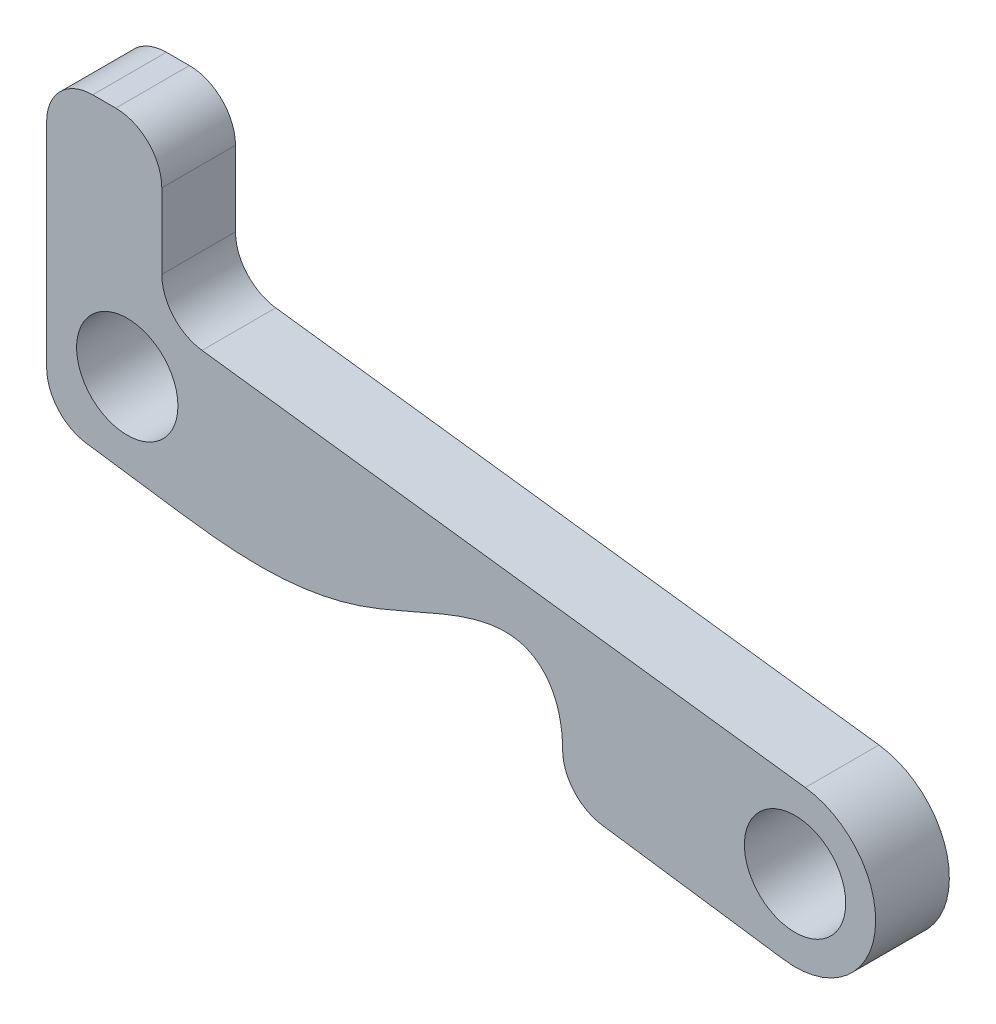
ISO-10303-21;
HEADER;
FILE_DESCRIPTION(('STEP AP214'),'2;1');
FILE_NAME('part.step','',(''),(''),'','','');
FILE_SCHEMA(('AUTOMOTIVE_DESIGN { 1 0 10303 214 1 1 1 1 }'));
ENDSEC;
DATA;
#1=APPLICATION_CONTEXT('core data for automotive mechanical design processes');
#2=APPLICATION_PROTOCOL_DEFINITION('international standard','automotive_design',2000,#1);
#3=PRODUCT_CONTEXT('',#1,'mechanical');
#4=PRODUCT('Part','Part','',(#3));
#5=PRODUCT_RELATED_PRODUCT_CATEGORY('part','',(#4));
#6=PRODUCT_DEFINITION_FORMATION('','',#4);
#7=PRODUCT_DEFINITION_CONTEXT('part definition',#1,'design');
#8=PRODUCT_DEFINITION('design','',#6,#7);
#9=PRODUCT_DEFINITION_SHAPE('','',#8);
#10=(LENGTH_UNIT() NAMED_UNIT(*) SI_UNIT(.MILLI.,.METRE.));
#11=(NAMED_UNIT(*) PLANE_ANGLE_UNIT() SI_UNIT($,.RADIAN.));
#12=(NAMED_UNIT(*) SI_UNIT($,.STERADIAN.) SOLID_ANGLE_UNIT());
#13=UNCERTAINTY_MEASURE_WITH_UNIT(LENGTH_MEASURE(1.E-05),#10,'distance_accuracy_value','');
#14=(GEOMETRIC_REPRESENTATION_CONTEXT(3) GLOBAL_UNCERTAINTY_ASSIGNED_CONTEXT((#13)) GLOBAL_UNIT_ASSIGNED_CONTEXT((#10,
#11,#12)) REPRESENTATION_CONTEXT('',''));
#15=CARTESIAN_POINT('',(0.,0.,0.));
#16=DIRECTION('',(0.,0.,1.));
#17=DIRECTION('',(1.,0.,0.));
#18=AXIS2_PLACEMENT_3D('',#15,#16,#17);
#19=CARTESIAN_POINT('',(5.85628286748262,-1.4674836129395,0.8));
#20=DIRECTION('',(0.,0.,-1.));
#21=DIRECTION('',(-1.,0.,0.));
#22=AXIS2_PLACEMENT_3D('',#19,#20,#21);
#23=PLANE('',#22);
#24=DIRECTION('',(0.,-1.,0.));
#25=VECTOR('',#24,1.);
#26=CARTESIAN_POINT('',(-1.75,4.92594525489793,0.8));
#27=LINE('',#26,#25);
#28=CARTESIAN_POINT('',(-1.75,3.92594525489793,0.8));
#29=VERTEX_POINT('',#28);
#30=CARTESIAN_POINT('',(-1.75,-0.705270965977039,0.8));
#31=VERTEX_POINT('',#30);
#32=EDGE_CURVE('E152',#29,#31,#27,.T.);
#33=ORIENTED_EDGE('',*,*,#32,.T.);
#34=CARTESIAN_POINT('',(-0.75,-0.705270965977041,0.8));
#35=DIRECTION('',(0.,0.,-1.));
#36=DIRECTION('',(-1.,0.,0.));
#37=AXIS2_PLACEMENT_3D('',#34,#35,#36);
#38=CIRCLE('',#37,1.);
#39=CARTESIAN_POINT('',(-0.889740600423094,-1.69545911203485,0.8));
#40=VERTEX_POINT('',#39);
#41=EDGE_CURVE('E147',#31,#40,#38,.F.);
#42=ORIENTED_EDGE('',*,*,#41,.T.);
#43=DIRECTION('',(0.990188146057805,-0.139740600423094,0.));
#44=VECTOR('',#43,1.);
#45=CARTESIAN_POINT('',(-1.75,-1.57405474510207,0.8));
#46=LINE('',#45,#44);
#47=CARTESIAN_POINT('',(1.13862290650122,-1.98171252302786,0.8));
#48=VERTEX_POINT('',#47);
#49=EDGE_CURVE('E139',#40,#48,#46,.T.);
#50=ORIENTED_EDGE('',*,*,#49,.T.);
#51=CARTESIAN_POINT('',(1.13862290650122,-1.98171252302786,0.8));
#52=CARTESIAN_POINT('',(2.48765410382144,-2.17209495716781,0.8));
#53=CARTESIAN_POINT('',(4.93090822651227,-2.30081907392415,0.8));
#54=CARTESIAN_POINT('',(8.48904271772371,0.0589233454925276,0.8));
#55=CARTESIAN_POINT('',(9.45087001881699,-1.49490037842196,0.8));
#56=CARTESIAN_POINT('',(9.4525852891331,-2.28840050606604,0.8));
#57=B_SPLINE_CURVE_WITH_KNOTS('',3,(#51,#52,#53,#54,#55,#56),.UNSPECIFIED.,.F.,.F.,(4,1,1,4),
(0.0513534356355238,0.45935835109183,0.836024653398881,1.),.UNSPECIFIED.);
#58=CARTESIAN_POINT('',(9.4525852891331,-2.28840050606604,0.8));
#59=VERTEX_POINT('',#58);
#60=EDGE_CURVE('E144',#48,#59,#57,.T.);
#61=ORIENTED_EDGE('',*,*,#60,.T.);
#62=CARTESIAN_POINT('',(10.4525829527738,-2.28623886015212,0.8));
#63=DIRECTION('',(0.,0.,1.));
#64=DIRECTION('',(-1.,0.,0.));
#65=AXIS2_PLACEMENT_3D('',#62,#63,#64);
#66=CIRCLE('',#65,1.);
#67=CARTESIAN_POINT('',(10.3128423523507,-3.27642700620993,0.8));
#68=VERTEX_POINT('',#67);
#69=EDGE_CURVE('E169',#59,#68,#66,.T.);
#70=ORIENTED_EDGE('',*,*,#69,.T.);
#71=DIRECTION('',(0.990188146057805,-0.139740600423094,0.));
#72=VECTOR('',#71,1.);
#73=CARTESIAN_POINT('',(12.7129072328709,-3.61513688553289,0.8));
#74=LINE('',#73,#72);
#75=CARTESIAN_POINT('',(14.2554539492596,-3.83282925560116,0.8));
#76=VERTEX_POINT('',#75);
#77=EDGE_CURVE('E172',#68,#76,#74,.T.);
#78=ORIENTED_EDGE('',*,*,#77,.T.);
#79=CARTESIAN_POINT('',(14.5,-2.1,0.8));
#80=DIRECTION('',(0.,0.,1.));
#81=DIRECTION('',(1.,0.,0.));
#82=AXIS2_PLACEMENT_3D('',#79,#80,#81);
#83=CIRCLE('',#82,1.75);
#84=CARTESIAN_POINT('',(14.7215004753904,-0.364074443012661,0.8));
#85=VERTEX_POINT('',#84);
#86=EDGE_CURVE('E262',#76,#85,#83,.T.);
#87=ORIENTED_EDGE('',*,*,#86,.T.);
#88=DIRECTION('',(-0.991957461135623,0.126571700223113,0.));
#89=VECTOR('',#88,1.);
#90=CARTESIAN_POINT('',(0.749999999999999,1.41865983655381,0.8));
#91=LINE('',#90,#89);
#92=CARTESIAN_POINT('',(1.62342829977689,1.30721220975822,0.8));
#93=VERTEX_POINT('',#92);
#94=EDGE_CURVE('E277',#85,#93,#91,.T.);
#95=ORIENTED_EDGE('',*,*,#94,.T.);
#96=CARTESIAN_POINT('',(1.75,2.29916967089385,0.8));
#97=DIRECTION('',(0.,0.,-1.));
#98=DIRECTION('',(-1.,0.,0.));
#99=AXIS2_PLACEMENT_3D('',#96,#97,#98);
#100=CIRCLE('',#99,1.);
#101=CARTESIAN_POINT('',(0.749999999999999,2.29916967089384,0.8));
#102=VERTEX_POINT('',#101);
#103=EDGE_CURVE('E11',#93,#102,#100,.T.);
#104=ORIENTED_EDGE('',*,*,#103,.T.);
#105=DIRECTION('',(0.,1.,0.));
#106=VECTOR('',#105,1.);
#107=CARTESIAN_POINT('',(0.749999999999999,1.41865983655381,0.8));
#108=LINE('',#107,#106);
#109=CARTESIAN_POINT('',(0.749999999999999,3.92594525489793,0.8));
#110=VERTEX_POINT('',#109);
#111=EDGE_CURVE('E272',#102,#110,#108,.T.);
#112=ORIENTED_EDGE('',*,*,#111,.T.);
#113=CARTESIAN_POINT('',(-0.25,3.92594525489793,0.8));
#114=DIRECTION('',(0.,0.,-1.));
#115=DIRECTION('',(-1.,0.,0.));
#116=AXIS2_PLACEMENT_3D('',#113,#114,#115);
#117=CIRCLE('',#116,1.);
#118=CARTESIAN_POINT('',(-0.25,4.92594525489793,0.8));
#119=VERTEX_POINT('',#118);
#120=EDGE_CURVE('E301',#110,#119,#117,.F.);
#121=ORIENTED_EDGE('',*,*,#120,.T.);
#122=DIRECTION('',(-1.,0.,0.));
#123=VECTOR('',#122,1.);
#124=CARTESIAN_POINT('',(0.749999999999999,4.92594525489793,0.8));
#125=LINE('',#124,#123);
#126=CARTESIAN_POINT('',(-0.750000000000001,4.92594525489793,0.8));
#127=VERTEX_POINT('',#126);
#128=EDGE_CURVE('E333',#119,#127,#125,.T.);
#129=ORIENTED_EDGE('',*,*,#128,.T.);
#130=CARTESIAN_POINT('',(-0.750000000000001,3.92594525489793,0.8));
#131=DIRECTION('',(0.,0.,-1.));
#132=DIRECTION('',(-1.,0.,0.));
#133=AXIS2_PLACEMENT_3D('',#130,#131,#132);
#134=CIRCLE('',#133,1.);
#135=EDGE_CURVE('E304',#127,#29,#134,.F.);
#136=ORIENTED_EDGE('',*,*,#135,.T.);
#137=EDGE_LOOP('',(#33,#42,#50,#61,#70,#78,#87,#95,#104,#112,#121,#129,#136));
#138=FACE_BOUND('',#137,.T.);
#139=CARTESIAN_POINT('',(0.,0.,0.8));
#140=DIRECTION('',(0.,0.,1.));
#141=DIRECTION('',(1.,0.,0.));
#142=AXIS2_PLACEMENT_3D('',#139,#140,#141);
#143=CIRCLE('',#142,1.1);
#144=CARTESIAN_POINT('',(1.1,0.,0.8));
#145=VERTEX_POINT('',#144);
#146=EDGE_CURVE('E370',#145,#145,#143,.T.);
#147=ORIENTED_EDGE('',*,*,#146,.F.);
#148=EDGE_LOOP('',(#147));
#149=FACE_BOUND('',#148,.T.);
#150=CARTESIAN_POINT('',(14.5,-2.1,0.8));
#151=DIRECTION('',(0.,0.,1.));
#152=DIRECTION('',(1.,0.,0.));
#153=AXIS2_PLACEMENT_3D('',#150,#151,#152);
#154=CIRCLE('',#153,1.1);
#155=CARTESIAN_POINT('',(15.6,-2.1,0.8));
#156=VERTEX_POINT('',#155);
#157=EDGE_CURVE('E379',#156,#156,#154,.T.);
#158=ORIENTED_EDGE('',*,*,#157,.F.);
#159=EDGE_LOOP('',(#158));
#160=FACE_BOUND('',#159,.T.);
#161=ADVANCED_FACE('F41',(#138,#149,#160),#23,.F.);
#162=CARTESIAN_POINT('',(5.85628286748262,-1.4674836129395,-0.8));
#163=DIRECTION('',(0.,0.,-1.));
#164=DIRECTION('',(-1.,0.,0.));
#165=AXIS2_PLACEMENT_3D('',#162,#163,#164);
#166=PLANE('',#165);
#167=CARTESIAN_POINT('',(0.,0.,-0.8));
#168=DIRECTION('',(0.,0.,1.));
#169=DIRECTION('',(1.,0.,0.));
#170=AXIS2_PLACEMENT_3D('',#167,#168,#169);
#171=CIRCLE('',#170,1.1);
#172=CARTESIAN_POINT('',(1.1,0.,-0.8));
#173=VERTEX_POINT('',#172);
#174=EDGE_CURVE('E338',#173,#173,#171,.T.);
#175=ORIENTED_EDGE('',*,*,#174,.T.);
#176=EDGE_LOOP('',(#175));
#177=FACE_BOUND('',#176,.T.);
#178=DIRECTION('',(0.990188146057805,-0.139740600423094,0.));
#179=VECTOR('',#178,1.);
#180=CARTESIAN_POINT('',(-1.75,-1.57405474510207,-0.8));
#181=LINE('',#180,#179);
#182=CARTESIAN_POINT('',(-0.889740600423094,-1.69545911203485,-0.8));
#183=VERTEX_POINT('',#182);
#184=CARTESIAN_POINT('',(1.13862290650122,-1.98171252302786,-0.8));
#185=VERTEX_POINT('',#184);
#186=EDGE_CURVE('E158',#183,#185,#181,.T.);
#187=ORIENTED_EDGE('',*,*,#186,.F.);
#188=CARTESIAN_POINT('',(-0.75,-0.705270965977041,-0.8));
#189=DIRECTION('',(0.,0.,-1.));
#190=DIRECTION('',(-1.,0.,0.));
#191=AXIS2_PLACEMENT_3D('',#188,#189,#190);
#192=CIRCLE('',#191,1.);
#193=CARTESIAN_POINT('',(-1.75,-0.705270965977039,-0.8));
#194=VERTEX_POINT('',#193);
#195=EDGE_CURVE('E291',#183,#194,#192,.T.);
#196=ORIENTED_EDGE('',*,*,#195,.T.);
#197=DIRECTION('',(0.,-1.,0.));
#198=VECTOR('',#197,1.);
#199=CARTESIAN_POINT('',(-1.75,4.92594525489793,-0.8));
#200=LINE('',#199,#198);
#201=CARTESIAN_POINT('',(-1.75,3.92594525489793,-0.8));
#202=VERTEX_POINT('',#201);
#203=EDGE_CURVE('E349',#202,#194,#200,.T.);
#204=ORIENTED_EDGE('',*,*,#203,.F.);
#205=CARTESIAN_POINT('',(-0.750000000000001,3.92594525489793,-0.8));
#206=DIRECTION('',(0.,0.,-1.));
#207=DIRECTION('',(-1.,0.,0.));
#208=AXIS2_PLACEMENT_3D('',#205,#206,#207);
#209=CIRCLE('',#208,1.);
#210=CARTESIAN_POINT('',(-0.750000000000001,4.92594525489793,-0.8));
#211=VERTEX_POINT('',#210);
#212=EDGE_CURVE('E288',#202,#211,#209,.T.);
#213=ORIENTED_EDGE('',*,*,#212,.T.);
#214=DIRECTION('',(-1.,0.,0.));
#215=VECTOR('',#214,1.);
#216=CARTESIAN_POINT('',(0.749999999999999,4.92594525489793,-0.8));
#217=LINE('',#216,#215);
#218=CARTESIAN_POINT('',(-0.25,4.92594525489793,-0.8));
#219=VERTEX_POINT('',#218);
#220=EDGE_CURVE('E354',#219,#211,#217,.T.);
#221=ORIENTED_EDGE('',*,*,#220,.F.);
#222=CARTESIAN_POINT('',(-0.25,3.92594525489793,-0.8));
#223=DIRECTION('',(0.,0.,-1.));
#224=DIRECTION('',(-1.,0.,0.));
#225=AXIS2_PLACEMENT_3D('',#222,#223,#224);
#226=CIRCLE('',#225,1.);
#227=CARTESIAN_POINT('',(0.749999999999999,3.92594525489793,-0.8));
#228=VERTEX_POINT('',#227);
#229=EDGE_CURVE('E285',#219,#228,#226,.T.);
#230=ORIENTED_EDGE('',*,*,#229,.T.);
#231=DIRECTION('',(0.,1.,0.));
#232=VECTOR('',#231,1.);
#233=CARTESIAN_POINT('',(0.749999999999999,1.41865983655381,-0.8));
#234=LINE('',#233,#232);
#235=CARTESIAN_POINT('',(0.749999999999999,2.29916967089384,-0.8));
#236=VERTEX_POINT('',#235);
#237=EDGE_CURVE('E326',#236,#228,#234,.T.);
#238=ORIENTED_EDGE('',*,*,#237,.F.);
#239=CARTESIAN_POINT('',(1.75,2.29916967089385,-0.8));
#240=DIRECTION('',(0.,0.,-1.));
#241=DIRECTION('',(-1.,0.,0.));
#242=AXIS2_PLACEMENT_3D('',#239,#240,#241);
#243=CIRCLE('',#242,1.);
#244=CARTESIAN_POINT('',(1.62342829977689,1.30721220975822,-0.8));
#245=VERTEX_POINT('',#244);
#246=EDGE_CURVE('E50',#236,#245,#243,.F.);
#247=ORIENTED_EDGE('',*,*,#246,.T.);
#248=DIRECTION('',(-0.991957461135623,0.126571700223113,0.));
#249=VECTOR('',#248,1.);
#250=CARTESIAN_POINT('',(0.749999999999999,1.41865983655381,-0.8));
#251=LINE('',#250,#249);
#252=CARTESIAN_POINT('',(14.7215004753904,-0.364074443012661,-0.8));
#253=VERTEX_POINT('',#252);
#254=EDGE_CURVE('E268',#253,#245,#251,.T.);
#255=ORIENTED_EDGE('',*,*,#254,.F.);
#256=CARTESIAN_POINT('',(14.5,-2.1,-0.8));
#257=DIRECTION('',(0.,0.,1.));
#258=DIRECTION('',(1.,0.,0.));
#259=AXIS2_PLACEMENT_3D('',#256,#257,#258);
#260=CIRCLE('',#259,1.75);
#261=CARTESIAN_POINT('',(14.2554539492596,-3.83282925560116,-0.8));
#262=VERTEX_POINT('',#261);
#263=EDGE_CURVE('E257',#262,#253,#260,.T.);
#264=ORIENTED_EDGE('',*,*,#263,.F.);
#265=DIRECTION('',(0.990188146057805,-0.139740600423094,0.));
#266=VECTOR('',#265,1.);
#267=CARTESIAN_POINT('',(12.7129072328709,-3.61513688553289,-0.8));
#268=LINE('',#267,#266);
#269=CARTESIAN_POINT('',(10.3128423523507,-3.27642700620993,-0.8));
#270=VERTEX_POINT('',#269);
#271=EDGE_CURVE('E245',#270,#262,#268,.T.);
#272=ORIENTED_EDGE('',*,*,#271,.F.);
#273=CARTESIAN_POINT('',(10.4525829527738,-2.28623886015212,-0.8));
#274=DIRECTION('',(0.,0.,1.));
#275=DIRECTION('',(-1.,0.,0.));
#276=AXIS2_PLACEMENT_3D('',#273,#274,#275);
#277=CIRCLE('',#276,1.);
#278=CARTESIAN_POINT('',(9.4525852891331,-2.28840050606604,-0.8));
#279=VERTEX_POINT('',#278);
#280=EDGE_CURVE('E258',#279,#270,#277,.T.);
#281=ORIENTED_EDGE('',*,*,#280,.F.);
#282=CARTESIAN_POINT('',(1.13862290650122,-1.98171252302786,-0.8));
#283=CARTESIAN_POINT('',(2.48765410382144,-2.17209495716781,-0.8));
#284=CARTESIAN_POINT('',(4.93090822651227,-2.30081907392415,-0.8));
#285=CARTESIAN_POINT('',(8.48904271772371,0.0589233454925276,-0.8));
#286=CARTESIAN_POINT('',(9.45087001881699,-1.49490037842196,-0.8));
#287=CARTESIAN_POINT('',(9.4525852891331,-2.28840050606604,-0.8));
#288=B_SPLINE_CURVE_WITH_KNOTS('',3,(#282,#283,#284,#285,#286,#287),.UNSPECIFIED.,.F.,.F.,(4,1,
1,4),(0.0513534356355238,0.45935835109183,0.836024653398881,1.),.UNSPECIFIED.);
#289=EDGE_CURVE('E347',#185,#279,#288,.T.);
#290=ORIENTED_EDGE('',*,*,#289,.F.);
#291=EDGE_LOOP('',(#187,#196,#204,#213,#221,#230,#238,#247,#255,#264,#272,#281,#290));
#292=FACE_BOUND('',#291,.T.);
#293=CARTESIAN_POINT('',(14.5,-2.1,-0.8));
#294=DIRECTION('',(0.,0.,1.));
#295=DIRECTION('',(1.,0.,0.));
#296=AXIS2_PLACEMENT_3D('',#293,#294,#295);
#297=CIRCLE('',#296,1.1);
#298=CARTESIAN_POINT('',(15.6,-2.1,-0.8));
#299=VERTEX_POINT('',#298);
#300=EDGE_CURVE('E382',#299,#299,#297,.T.);
#301=ORIENTED_EDGE('',*,*,#300,.T.);
#302=EDGE_LOOP('',(#301));
#303=FACE_BOUND('',#302,.T.);
#304=ADVANCED_FACE('F200',(#177,#292,#303),#166,.T.);
#305=CARTESIAN_POINT('',(0.749999999999999,1.41865983655381,0.8));
#306=DIRECTION('',(-1.,0.,0.));
#307=DIRECTION('',(0.,0.,1.));
#308=AXIS2_PLACEMENT_3D('',#305,#306,#307);
#309=PLANE('',#308);
#310=ORIENTED_EDGE('',*,*,#237,.T.);
#311=DIRECTION('',(0.,0.,-1.));
#312=VECTOR('',#311,1.);
#313=CARTESIAN_POINT('',(0.749999999999999,3.92594525489793,0.8));
#314=LINE('',#313,#312);
#315=EDGE_CURVE('E319',#228,#110,#314,.F.);
#316=ORIENTED_EDGE('',*,*,#315,.T.);
#317=ORIENTED_EDGE('',*,*,#111,.F.);
#318=DIRECTION('',(0.,0.,-1.));
#319=VECTOR('',#318,1.);
#320=CARTESIAN_POINT('',(0.75,2.29916967089385,-0.8));
#321=LINE('',#320,#319);
#322=EDGE_CURVE('E315',#102,#236,#321,.T.);
#323=ORIENTED_EDGE('',*,*,#322,.T.);
#324=EDGE_LOOP('',(#310,#316,#317,#323));
#325=FACE_BOUND('',#324,.T.);
#326=ADVANCED_FACE('F197',(#325),#309,.F.);
#327=CARTESIAN_POINT('',(0.749999999999999,4.92594525489793,0.8));
#328=DIRECTION('',(0.,-1.,0.));
#329=DIRECTION('',(0.,0.,-1.));
#330=AXIS2_PLACEMENT_3D('',#327,#328,#329);
#331=PLANE('',#330);
#332=ORIENTED_EDGE('',*,*,#220,.T.);
#333=DIRECTION('',(0.,0.,-1.));
#334=VECTOR('',#333,1.);
#335=CARTESIAN_POINT('',(-0.750000000000001,4.92594525489793,0.8));
#336=LINE('',#335,#334);
#337=EDGE_CURVE('E65',#211,#127,#336,.F.);
#338=ORIENTED_EDGE('',*,*,#337,.T.);
#339=ORIENTED_EDGE('',*,*,#128,.F.);
#340=DIRECTION('',(0.,0.,-1.));
#341=VECTOR('',#340,1.);
#342=CARTESIAN_POINT('',(-0.25,4.92594525489793,0.8));
#343=LINE('',#342,#341);
#344=EDGE_CURVE('E309',#119,#219,#343,.T.);
#345=ORIENTED_EDGE('',*,*,#344,.T.);
#346=EDGE_LOOP('',(#332,#338,#339,#345));
#347=FACE_BOUND('',#346,.T.);
#348=ADVANCED_FACE('F193',(#347),#331,.F.);
#349=CARTESIAN_POINT('',(-1.75,4.92594525489793,0.8));
#350=DIRECTION('',(1.,0.,0.));
#351=DIRECTION('',(0.,1.,0.));
#352=AXIS2_PLACEMENT_3D('',#349,#350,#351);
#353=PLANE('',#352);
#354=ORIENTED_EDGE('',*,*,#203,.T.);
#355=DIRECTION('',(0.,0.,-1.));
#356=VECTOR('',#355,1.);
#357=CARTESIAN_POINT('',(-1.75,-0.705270965977041,0.8));
#358=LINE('',#357,#356);
#359=EDGE_CURVE('E298',#194,#31,#358,.F.);
#360=ORIENTED_EDGE('',*,*,#359,.T.);
#361=ORIENTED_EDGE('',*,*,#32,.F.);
#362=DIRECTION('',(0.,0.,-1.));
#363=VECTOR('',#362,1.);
#364=CARTESIAN_POINT('',(-1.75,3.92594525489793,0.8));
#365=LINE('',#364,#363);
#366=EDGE_CURVE('E294',#29,#202,#365,.T.);
#367=ORIENTED_EDGE('',*,*,#366,.T.);
#368=EDGE_LOOP('',(#354,#360,#361,#367));
#369=FACE_BOUND('',#368,.T.);
#370=ADVANCED_FACE('F190',(#369),#353,.F.);
#371=CARTESIAN_POINT('',(-1.75,-1.57405474510207,0.8));
#372=DIRECTION('',(0.139740600423094,0.990188146057805,0.));
#373=DIRECTION('',(-0.990188146057805,0.139740600423094,0.));
#374=AXIS2_PLACEMENT_3D('',#371,#372,#373);
#375=PLANE('',#374);
#376=ORIENTED_EDGE('',*,*,#49,.F.);
#377=DIRECTION('',(0.,0.,-1.));
#378=VECTOR('',#377,1.);
#379=CARTESIAN_POINT('',(-0.889740600423094,-1.69545911203485,0.8));
#380=LINE('',#379,#378);
#381=EDGE_CURVE('E162',#40,#183,#380,.T.);
#382=ORIENTED_EDGE('',*,*,#381,.T.);
#383=ORIENTED_EDGE('',*,*,#186,.T.);
#384=DIRECTION('',(0.,0.,-1.));
#385=VECTOR('',#384,1.);
#386=CARTESIAN_POINT('',(1.13862290650122,-1.98171252302786,0.8));
#387=LINE('',#386,#385);
#388=EDGE_CURVE('E155',#48,#185,#387,.T.);
#389=ORIENTED_EDGE('',*,*,#388,.F.);
#390=EDGE_LOOP('',(#376,#382,#383,#389));
#391=FACE_BOUND('',#390,.T.);
#392=ADVANCED_FACE('F156',(#391),#375,.F.);
#393=DIRECTION('',(0.,0.,-1.));
#394=VECTOR('',#393,1.);
#395=SURFACE_OF_LINEAR_EXTRUSION('',#57,#394);
#396=ORIENTED_EDGE('',*,*,#289,.T.);
#397=DIRECTION('',(0.,0.,-1.));
#398=VECTOR('',#397,1.);
#399=CARTESIAN_POINT('',(9.4525852891331,-2.28840050606604,0.8));
#400=LINE('',#399,#398);
#401=EDGE_CURVE('E163',#59,#279,#400,.T.);
#402=ORIENTED_EDGE('',*,*,#401,.F.);
#403=ORIENTED_EDGE('',*,*,#60,.F.);
#404=ORIENTED_EDGE('',*,*,#388,.T.);
#405=EDGE_LOOP('',(#396,#402,#403,#404));
#406=FACE_BOUND('',#405,.T.);
#407=ADVANCED_FACE('F165',(#406),#395,.F.);
#408=CARTESIAN_POINT('',(10.4525829527738,-2.28623886015212,0.8));
#409=DIRECTION('',(0.,0.,-1.));
#410=DIRECTION('',(-1.,0.,0.));
#411=AXIS2_PLACEMENT_3D('',#408,#409,#410);
#412=CYLINDRICAL_SURFACE('',#411,1.);
#413=ORIENTED_EDGE('',*,*,#280,.T.);
#414=DIRECTION('',(0.,0.,-1.));
#415=VECTOR('',#414,1.);
#416=CARTESIAN_POINT('',(10.3128423523507,-3.27642700620993,0.8));
#417=LINE('',#416,#415);
#418=EDGE_CURVE('E251',#68,#270,#417,.T.);
#419=ORIENTED_EDGE('',*,*,#418,.F.);
#420=ORIENTED_EDGE('',*,*,#69,.F.);
#421=ORIENTED_EDGE('',*,*,#401,.T.);
#422=EDGE_LOOP('',(#413,#419,#420,#421));
#423=FACE_BOUND('',#422,.T.);
#424=ADVANCED_FACE('F186',(#423),#412,.T.);
#425=CARTESIAN_POINT('',(12.7129072328709,-3.61513688553289,0.8));
#426=DIRECTION('',(0.139740600423094,0.990188146057805,0.));
#427=DIRECTION('',(-0.990188146057805,0.139740600423094,0.));
#428=AXIS2_PLACEMENT_3D('',#425,#426,#427);
#429=PLANE('',#428);
#430=ORIENTED_EDGE('',*,*,#271,.T.);
#431=DIRECTION('',(0.,0.,-1.));
#432=VECTOR('',#431,1.);
#433=CARTESIAN_POINT('',(14.2554539492596,-3.83282925560116,0.8));
#434=LINE('',#433,#432);
#435=EDGE_CURVE('E248',#76,#262,#434,.T.);
#436=ORIENTED_EDGE('',*,*,#435,.F.);
#437=ORIENTED_EDGE('',*,*,#77,.F.);
#438=ORIENTED_EDGE('',*,*,#418,.T.);
#439=EDGE_LOOP('',(#430,#436,#437,#438));
#440=FACE_BOUND('',#439,.T.);
#441=ADVANCED_FACE('F235',(#440),#429,.F.);
#442=CARTESIAN_POINT('',(14.5,-2.1,0.8));
#443=DIRECTION('',(0.,0.,-1.));
#444=DIRECTION('',(-1.,0.,0.));
#445=AXIS2_PLACEMENT_3D('',#442,#443,#444);
#446=CYLINDRICAL_SURFACE('',#445,1.75);
#447=ORIENTED_EDGE('',*,*,#263,.T.);
#448=DIRECTION('',(0.,0.,-1.));
#449=VECTOR('',#448,1.);
#450=CARTESIAN_POINT('',(14.7215004753904,-0.364074443012661,0.8));
#451=LINE('',#450,#449);
#452=EDGE_CURVE('E264',#85,#253,#451,.T.);
#453=ORIENTED_EDGE('',*,*,#452,.F.);
#454=ORIENTED_EDGE('',*,*,#86,.F.);
#455=ORIENTED_EDGE('',*,*,#435,.T.);
#456=EDGE_LOOP('',(#447,#453,#454,#455));
#457=FACE_BOUND('',#456,.T.);
#458=ADVANCED_FACE('F233',(#457),#446,.T.);
#459=CARTESIAN_POINT('',(0.749999999999999,1.41865983655381,0.8));
#460=DIRECTION('',(-0.126571700223113,-0.991957461135623,0.));
#461=DIRECTION('',(0.991957461135623,-0.126571700223113,0.));
#462=AXIS2_PLACEMENT_3D('',#459,#460,#461);
#463=PLANE('',#462);
#464=ORIENTED_EDGE('',*,*,#254,.T.);
#465=DIRECTION('',(0.,0.,-1.));
#466=VECTOR('',#465,1.);
#467=CARTESIAN_POINT('',(1.62342829977689,1.30721220975822,0.8));
#468=LINE('',#467,#466);
#469=EDGE_CURVE('E57',#245,#93,#468,.F.);
#470=ORIENTED_EDGE('',*,*,#469,.T.);
#471=ORIENTED_EDGE('',*,*,#94,.F.);
#472=ORIENTED_EDGE('',*,*,#452,.T.);
#473=EDGE_LOOP('',(#464,#470,#471,#472));
#474=FACE_BOUND('',#473,.T.);
#475=ADVANCED_FACE('F230',(#474),#463,.F.);
#476=CARTESIAN_POINT('',(0.,0.,0.8));
#477=DIRECTION('',(0.,0.,-1.));
#478=DIRECTION('',(-1.,0.,0.));
#479=AXIS2_PLACEMENT_3D('',#476,#477,#478);
#480=CYLINDRICAL_SURFACE('',#479,1.1);
#481=ORIENTED_EDGE('',*,*,#146,.T.);
#482=EDGE_LOOP('',(#481));
#483=FACE_BOUND('',#482,.T.);
#484=ORIENTED_EDGE('',*,*,#174,.F.);
#485=EDGE_LOOP('',(#484));
#486=FACE_BOUND('',#485,.T.);
#487=ADVANCED_FACE('F227',(#483,#486),#480,.F.);
#488=CARTESIAN_POINT('',(14.5,-2.1,0.8));
#489=DIRECTION('',(0.,0.,-1.));
#490=DIRECTION('',(-1.,0.,0.));
#491=AXIS2_PLACEMENT_3D('',#488,#489,#490);
#492=CYLINDRICAL_SURFACE('',#491,1.1);
#493=ORIENTED_EDGE('',*,*,#157,.T.);
#494=EDGE_LOOP('',(#493));
#495=FACE_BOUND('',#494,.T.);
#496=ORIENTED_EDGE('',*,*,#300,.F.);
#497=EDGE_LOOP('',(#496));
#498=FACE_BOUND('',#497,.T.);
#499=ADVANCED_FACE('F206',(#495,#498),#492,.F.);
#500=CARTESIAN_POINT('',(-0.75,-0.705270965977041,0.8));
#501=DIRECTION('',(0.,0.,-1.));
#502=DIRECTION('',(-1.,0.,0.));
#503=AXIS2_PLACEMENT_3D('',#500,#501,#502);
#504=CYLINDRICAL_SURFACE('',#503,1.);
#505=ORIENTED_EDGE('',*,*,#41,.F.);
#506=ORIENTED_EDGE('',*,*,#359,.F.);
#507=ORIENTED_EDGE('',*,*,#195,.F.);
#508=ORIENTED_EDGE('',*,*,#381,.F.);
#509=EDGE_LOOP('',(#505,#506,#507,#508));
#510=FACE_BOUND('',#509,.T.);
#511=ADVANCED_FACE('F202',(#510),#504,.T.);
#512=CARTESIAN_POINT('',(-0.750000000000001,3.92594525489793,0.8));
#513=DIRECTION('',(0.,0.,-1.));
#514=DIRECTION('',(-1.,0.,0.));
#515=AXIS2_PLACEMENT_3D('',#512,#513,#514);
#516=CYLINDRICAL_SURFACE('',#515,1.);
#517=ORIENTED_EDGE('',*,*,#135,.F.);
#518=ORIENTED_EDGE('',*,*,#337,.F.);
#519=ORIENTED_EDGE('',*,*,#212,.F.);
#520=ORIENTED_EDGE('',*,*,#366,.F.);
#521=EDGE_LOOP('',(#517,#518,#519,#520));
#522=FACE_BOUND('',#521,.T.);
#523=ADVANCED_FACE('F205',(#522),#516,.T.);
#524=CARTESIAN_POINT('',(-0.25,3.92594525489793,0.8));
#525=DIRECTION('',(0.,0.,-1.));
#526=DIRECTION('',(-1.,0.,0.));
#527=AXIS2_PLACEMENT_3D('',#524,#525,#526);
#528=CYLINDRICAL_SURFACE('',#527,1.);
#529=ORIENTED_EDGE('',*,*,#120,.F.);
#530=ORIENTED_EDGE('',*,*,#315,.F.);
#531=ORIENTED_EDGE('',*,*,#229,.F.);
#532=ORIENTED_EDGE('',*,*,#344,.F.);
#533=EDGE_LOOP('',(#529,#530,#531,#532));
#534=FACE_BOUND('',#533,.T.);
#535=ADVANCED_FACE('F209',(#534),#528,.T.);
#536=CARTESIAN_POINT('',(1.75,2.29916967089385,0.8));
#537=DIRECTION('',(0.,0.,1.));
#538=DIRECTION('',(1.,0.,0.));
#539=AXIS2_PLACEMENT_3D('',#536,#537,#538);
#540=CYLINDRICAL_SURFACE('',#539,1.);
#541=ORIENTED_EDGE('',*,*,#103,.F.);
#542=ORIENTED_EDGE('',*,*,#469,.F.);
#543=ORIENTED_EDGE('',*,*,#246,.F.);
#544=ORIENTED_EDGE('',*,*,#322,.F.);
#545=EDGE_LOOP('',(#541,#542,#543,#544));
#546=FACE_BOUND('',#545,.T.);
#547=ADVANCED_FACE('F43',(#546),#540,.F.);
#548=CLOSED_SHELL('',(#161,#304,#326,#348,#370,#392,#407,#424,#441,#458,#475,#487,#499,#511,
#523,#535,#547));
#549=MANIFOLD_SOLID_BREP('B2',#548);
#550=ADVANCED_BREP_SHAPE_REPRESENTATION('',(#18,#549),#14);
#551=SHAPE_DEFINITION_REPRESENTATION(#9,#550);
ENDSEC;
END-ISO-10303-21;
